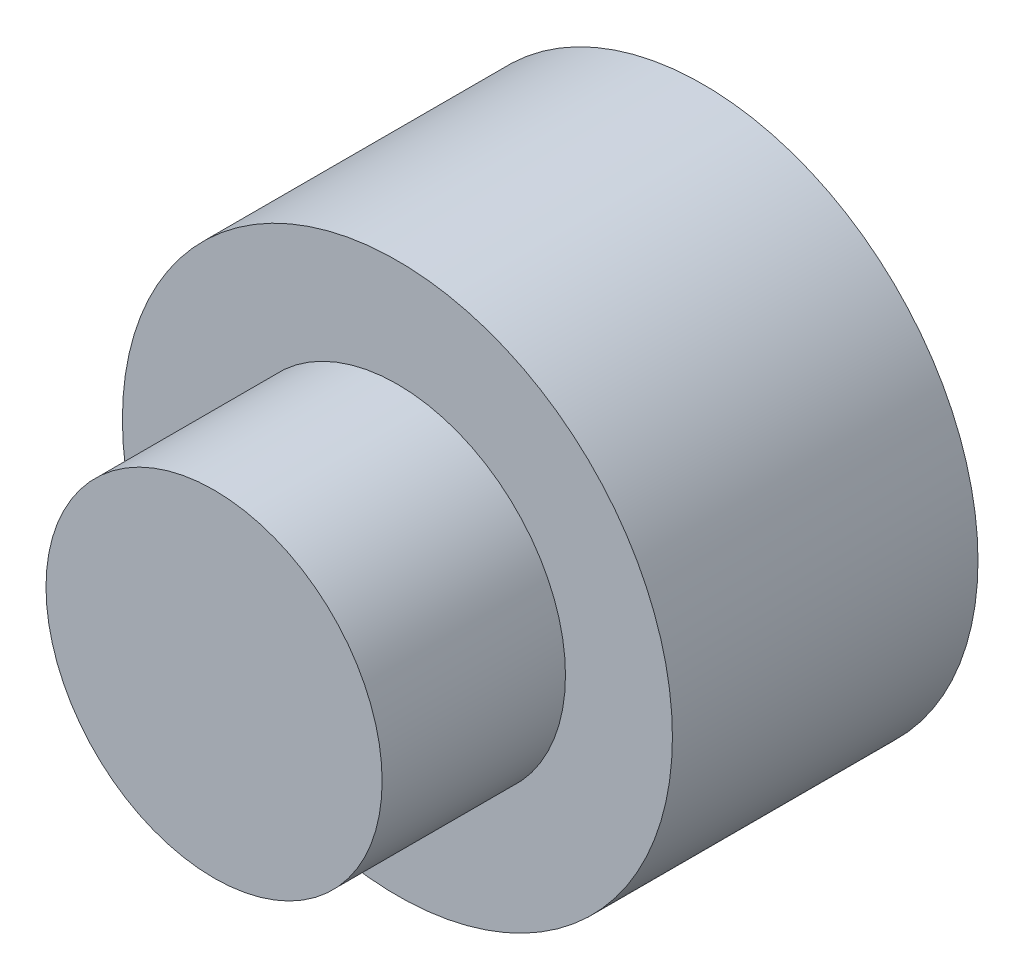
ISO-10303-21;
HEADER;
FILE_DESCRIPTION(('STEP AP214'),'2;1');
FILE_NAME('part.step','',(''),(''),'','','');
FILE_SCHEMA(('AUTOMOTIVE_DESIGN { 1 0 10303 214 1 1 1 1 }'));
ENDSEC;
DATA;
#1=APPLICATION_CONTEXT('core data for automotive mechanical design processes');
#2=APPLICATION_PROTOCOL_DEFINITION('international standard','automotive_design',2000,#1);
#3=PRODUCT_CONTEXT('',#1,'mechanical');
#4=PRODUCT('Part','Part','',(#3));
#5=PRODUCT_RELATED_PRODUCT_CATEGORY('part','',(#4));
#6=PRODUCT_DEFINITION_FORMATION('','',#4);
#7=PRODUCT_DEFINITION_CONTEXT('part definition',#1,'design');
#8=PRODUCT_DEFINITION('design','',#6,#7);
#9=PRODUCT_DEFINITION_SHAPE('','',#8);
#10=(LENGTH_UNIT() NAMED_UNIT(*) SI_UNIT(.MILLI.,.METRE.));
#11=(NAMED_UNIT(*) PLANE_ANGLE_UNIT() SI_UNIT($,.RADIAN.));
#12=(NAMED_UNIT(*) SI_UNIT($,.STERADIAN.) SOLID_ANGLE_UNIT());
#13=UNCERTAINTY_MEASURE_WITH_UNIT(LENGTH_MEASURE(1.E-05),#10,'distance_accuracy_value','');
#14=(GEOMETRIC_REPRESENTATION_CONTEXT(3) GLOBAL_UNCERTAINTY_ASSIGNED_CONTEXT((#13)) GLOBAL_UNIT_ASSIGNED_CONTEXT((#10,
#11,#12)) REPRESENTATION_CONTEXT('',''));
#15=CARTESIAN_POINT('',(0.,0.,0.));
#16=DIRECTION('',(0.,0.,1.));
#17=DIRECTION('',(1.,0.,0.));
#18=AXIS2_PLACEMENT_3D('',#15,#16,#17);
#19=CARTESIAN_POINT('',(-4.5,0.,-0.318965517241394));
#20=DIRECTION('',(0.,0.,-1.));
#21=DIRECTION('',(-1.,0.,0.));
#22=AXIS2_PLACEMENT_3D('',#19,#20,#21);
#23=PLANE('',#22);
#24=CARTESIAN_POINT('',(0.,0.,-0.318965517241393));
#25=DIRECTION('',(0.,0.,-1.));
#26=DIRECTION('',(-1.,0.,0.));
#27=AXIS2_PLACEMENT_3D('',#24,#25,#26);
#28=CIRCLE('',#27,4.5);
#29=CARTESIAN_POINT('',(-4.5,0.,-0.318965517241393));
#30=VERTEX_POINT('',#29);
#31=EDGE_CURVE('E45',#30,#30,#28,.T.);
#32=ORIENTED_EDGE('',*,*,#31,.T.);
#33=EDGE_LOOP('',(#32));
#34=FACE_BOUND('',#33,.T.);
#35=ADVANCED_FACE('F31',(#34),#23,.T.);
#36=CARTESIAN_POINT('',(-2.75,0.,7.68103448275861));
#37=DIRECTION('',(0.,0.,1.));
#38=DIRECTION('',(1.,0.,0.));
#39=AXIS2_PLACEMENT_3D('',#36,#37,#38);
#40=PLANE('',#39);
#41=CARTESIAN_POINT('',(0.,0.,7.68103448275861));
#42=DIRECTION('',(0.,0.,-1.));
#43=DIRECTION('',(-1.,0.,0.));
#44=AXIS2_PLACEMENT_3D('',#41,#42,#43);
#45=CIRCLE('',#44,2.75);
#46=CARTESIAN_POINT('',(-2.75,0.,7.68103448275861));
#47=VERTEX_POINT('',#46);
#48=EDGE_CURVE('E10',#47,#47,#45,.T.);
#49=ORIENTED_EDGE('',*,*,#48,.F.);
#50=EDGE_LOOP('',(#49));
#51=FACE_BOUND('',#50,.T.);
#52=ADVANCED_FACE('F63',(#51),#40,.T.);
#53=CARTESIAN_POINT('',(0.,0.,-18.0172413793103));
#54=DIRECTION('',(0.,0.,-1.));
#55=DIRECTION('',(-1.,0.,0.));
#56=AXIS2_PLACEMENT_3D('',#53,#54,#55);
#57=CYLINDRICAL_SURFACE('',#56,2.75);
#58=ORIENTED_EDGE('',*,*,#48,.T.);
#59=EDGE_LOOP('',(#58));
#60=FACE_BOUND('',#59,.T.);
#61=CARTESIAN_POINT('',(0.,0.,4.6810344827586));
#62=DIRECTION('',(0.,0.,-1.));
#63=DIRECTION('',(-1.,0.,0.));
#64=AXIS2_PLACEMENT_3D('',#61,#62,#63);
#65=CIRCLE('',#64,2.75);
#66=CARTESIAN_POINT('',(-2.75,0.,4.6810344827586));
#67=VERTEX_POINT('',#66);
#68=EDGE_CURVE('E37',#67,#67,#65,.T.);
#69=ORIENTED_EDGE('',*,*,#68,.F.);
#70=EDGE_LOOP('',(#69));
#71=FACE_BOUND('',#70,.T.);
#72=ADVANCED_FACE('F60',(#60,#71),#57,.T.);
#73=CARTESIAN_POINT('',(-4.5,0.,4.68103448275861));
#74=DIRECTION('',(0.,0.,1.));
#75=DIRECTION('',(1.,0.,0.));
#76=AXIS2_PLACEMENT_3D('',#73,#74,#75);
#77=PLANE('',#76);
#78=ORIENTED_EDGE('',*,*,#68,.T.);
#79=EDGE_LOOP('',(#78));
#80=FACE_BOUND('',#79,.T.);
#81=CARTESIAN_POINT('',(0.,0.,4.6810344827586));
#82=DIRECTION('',(0.,0.,-1.));
#83=DIRECTION('',(-1.,0.,0.));
#84=AXIS2_PLACEMENT_3D('',#81,#82,#83);
#85=CIRCLE('',#84,4.5);
#86=CARTESIAN_POINT('',(-4.5,0.,4.6810344827586));
#87=VERTEX_POINT('',#86);
#88=EDGE_CURVE('E41',#87,#87,#85,.T.);
#89=ORIENTED_EDGE('',*,*,#88,.F.);
#90=EDGE_LOOP('',(#89));
#91=FACE_BOUND('',#90,.T.);
#92=ADVANCED_FACE('F54',(#80,#91),#77,.T.);
#93=CARTESIAN_POINT('',(0.,0.,-18.0172413793103));
#94=DIRECTION('',(0.,0.,-1.));
#95=DIRECTION('',(-1.,0.,0.));
#96=AXIS2_PLACEMENT_3D('',#93,#94,#95);
#97=CYLINDRICAL_SURFACE('',#96,4.5);
#98=ORIENTED_EDGE('',*,*,#88,.T.);
#99=EDGE_LOOP('',(#98));
#100=FACE_BOUND('',#99,.T.);
#101=ORIENTED_EDGE('',*,*,#31,.F.);
#102=EDGE_LOOP('',(#101));
#103=FACE_BOUND('',#102,.T.);
#104=ADVANCED_FACE('F52',(#100,#103),#97,.T.);
#105=CLOSED_SHELL('',(#35,#52,#72,#92,#104));
#106=MANIFOLD_SOLID_BREP('B2',#105);
#107=ADVANCED_BREP_SHAPE_REPRESENTATION('',(#18,#106),#14);
#108=SHAPE_DEFINITION_REPRESENTATION(#9,#107);
ENDSEC;
END-ISO-10303-21;
